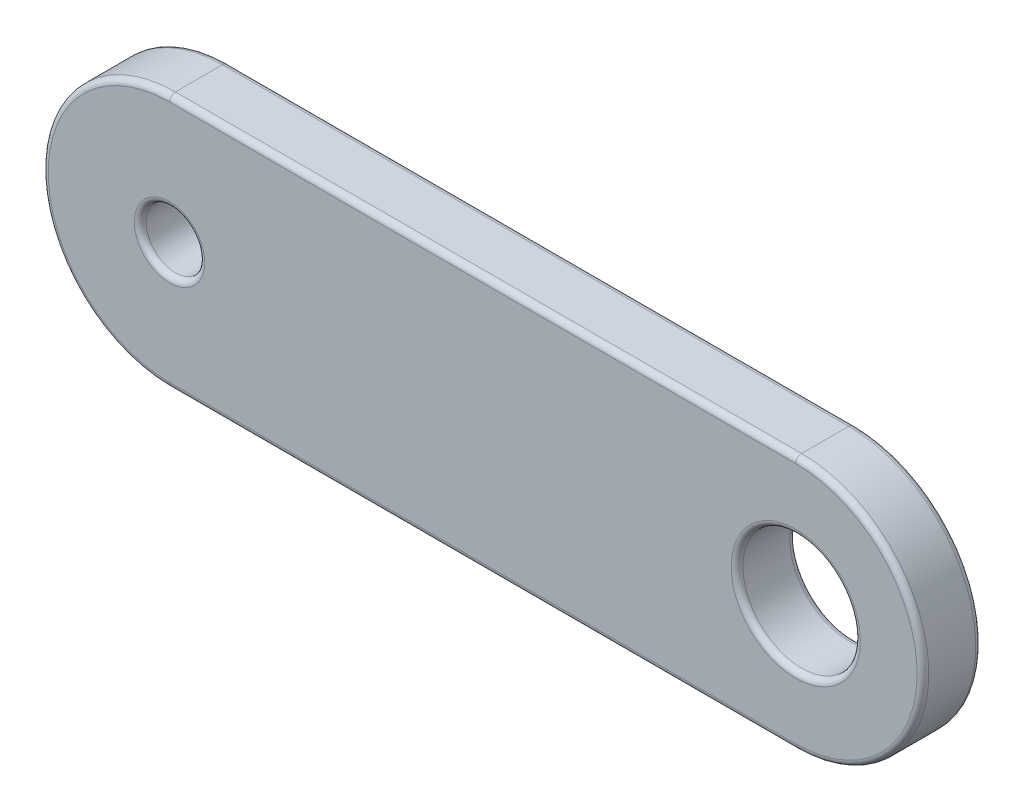
ISO-10303-21;
HEADER;
FILE_DESCRIPTION(('STEP AP214'),'2;1');
FILE_NAME('part.step','',(''),(''),'','','');
FILE_SCHEMA(('AUTOMOTIVE_DESIGN { 1 0 10303 214 1 1 1 1 }'));
ENDSEC;
DATA;
#1=APPLICATION_CONTEXT('core data for automotive mechanical design processes');
#2=APPLICATION_PROTOCOL_DEFINITION('international standard','automotive_design',2000,#1);
#3=PRODUCT_CONTEXT('',#1,'mechanical');
#4=PRODUCT('Part','Part','',(#3));
#5=PRODUCT_RELATED_PRODUCT_CATEGORY('part','',(#4));
#6=PRODUCT_DEFINITION_FORMATION('','',#4);
#7=PRODUCT_DEFINITION_CONTEXT('part definition',#1,'design');
#8=PRODUCT_DEFINITION('design','',#6,#7);
#9=PRODUCT_DEFINITION_SHAPE('','',#8);
#10=(LENGTH_UNIT() NAMED_UNIT(*) SI_UNIT(.MILLI.,.METRE.));
#11=(NAMED_UNIT(*) PLANE_ANGLE_UNIT() SI_UNIT($,.RADIAN.));
#12=(NAMED_UNIT(*) SI_UNIT($,.STERADIAN.) SOLID_ANGLE_UNIT());
#13=UNCERTAINTY_MEASURE_WITH_UNIT(LENGTH_MEASURE(1.E-05),#10,'distance_accuracy_value','');
#14=(GEOMETRIC_REPRESENTATION_CONTEXT(3) GLOBAL_UNCERTAINTY_ASSIGNED_CONTEXT((#13)) GLOBAL_UNIT_ASSIGNED_CONTEXT((#10,
#11,#12)) REPRESENTATION_CONTEXT('',''));
#15=CARTESIAN_POINT('',(0.,0.,0.));
#16=DIRECTION('',(0.,0.,1.));
#17=DIRECTION('',(1.,0.,0.));
#18=AXIS2_PLACEMENT_3D('',#15,#16,#17);
#19=CARTESIAN_POINT('',(-8.,0.,0.75));
#20=DIRECTION('',(0.,0.,1.));
#21=DIRECTION('',(1.,0.,0.));
#22=AXIS2_PLACEMENT_3D('',#19,#20,#21);
#23=PLANE('',#22);
#24=CARTESIAN_POINT('',(8.,0.,0.75));
#25=DIRECTION('',(0.,0.,1.));
#26=DIRECTION('',(1.,0.,0.));
#27=AXIS2_PLACEMENT_3D('',#24,#25,#26);
#28=CIRCLE('',#27,1.65);
#29=CARTESIAN_POINT('',(9.65,0.,0.75));
#30=VERTEX_POINT('',#29);
#31=EDGE_CURVE('E11',#30,#30,#28,.F.);
#32=ORIENTED_EDGE('',*,*,#31,.T.);
#33=EDGE_LOOP('',(#32));
#34=FACE_BOUND('',#33,.T.);
#35=CARTESIAN_POINT('',(8.,0.,0.75));
#36=DIRECTION('',(0.,0.,1.));
#37=DIRECTION('',(1.,0.,0.));
#38=AXIS2_PLACEMENT_3D('',#35,#36,#37);
#39=CIRCLE('',#38,3.1);
#40=CARTESIAN_POINT('',(8.,-3.1,0.75));
#41=VERTEX_POINT('',#40);
#42=CARTESIAN_POINT('',(8.,3.1,0.75));
#43=VERTEX_POINT('',#42);
#44=EDGE_CURVE('E56',#41,#43,#39,.T.);
#45=ORIENTED_EDGE('',*,*,#44,.T.);
#46=DIRECTION('',(-1.,0.,0.));
#47=VECTOR('',#46,1.);
#48=CARTESIAN_POINT('',(-8.,3.1,0.75));
#49=LINE('',#48,#47);
#50=CARTESIAN_POINT('',(-8.,3.1,0.75));
#51=VERTEX_POINT('',#50);
#52=EDGE_CURVE('E48',#43,#51,#49,.T.);
#53=ORIENTED_EDGE('',*,*,#52,.T.);
#54=CARTESIAN_POINT('',(-8.,0.,0.75));
#55=DIRECTION('',(0.,0.,1.));
#56=DIRECTION('',(1.,0.,0.));
#57=AXIS2_PLACEMENT_3D('',#54,#55,#56);
#58=CIRCLE('',#57,3.1);
#59=CARTESIAN_POINT('',(-8.,-3.1,0.75));
#60=VERTEX_POINT('',#59);
#61=EDGE_CURVE('E174',#51,#60,#58,.T.);
#62=ORIENTED_EDGE('',*,*,#61,.T.);
#63=DIRECTION('',(1.,0.,0.));
#64=VECTOR('',#63,1.);
#65=CARTESIAN_POINT('',(8.,-3.1,0.75));
#66=LINE('',#65,#64);
#67=EDGE_CURVE('E61',#60,#41,#66,.T.);
#68=ORIENTED_EDGE('',*,*,#67,.T.);
#69=EDGE_LOOP('',(#45,#53,#62,#68));
#70=FACE_BOUND('',#69,.T.);
#71=CARTESIAN_POINT('',(-8.,0.,0.75));
#72=DIRECTION('',(0.,0.,1.));
#73=DIRECTION('',(1.,0.,0.));
#74=AXIS2_PLACEMENT_3D('',#71,#72,#73);
#75=CIRCLE('',#74,0.9);
#76=CARTESIAN_POINT('',(-7.1,0.,0.75));
#77=VERTEX_POINT('',#76);
#78=EDGE_CURVE('E171',#77,#77,#75,.F.);
#79=ORIENTED_EDGE('',*,*,#78,.T.);
#80=EDGE_LOOP('',(#79));
#81=FACE_BOUND('',#80,.T.);
#82=ADVANCED_FACE('F39',(#34,#70,#81),#23,.T.);
#83=CARTESIAN_POINT('',(-8.,0.,-0.75));
#84=DIRECTION('',(0.,0.,1.));
#85=DIRECTION('',(1.,0.,0.));
#86=AXIS2_PLACEMENT_3D('',#83,#84,#85);
#87=PLANE('',#86);
#88=CARTESIAN_POINT('',(8.,0.,-0.75));
#89=DIRECTION('',(0.,0.,1.));
#90=DIRECTION('',(1.,0.,0.));
#91=AXIS2_PLACEMENT_3D('',#88,#89,#90);
#92=CIRCLE('',#91,1.65);
#93=CARTESIAN_POINT('',(9.65,0.,-0.75));
#94=VERTEX_POINT('',#93);
#95=EDGE_CURVE('E136',#94,#94,#92,.T.);
#96=ORIENTED_EDGE('',*,*,#95,.T.);
#97=EDGE_LOOP('',(#96));
#98=FACE_BOUND('',#97,.T.);
#99=CARTESIAN_POINT('',(-8.,0.,-0.75));
#100=DIRECTION('',(0.,0.,1.));
#101=DIRECTION('',(1.,0.,0.));
#102=AXIS2_PLACEMENT_3D('',#99,#100,#101);
#103=CIRCLE('',#102,0.9);
#104=CARTESIAN_POINT('',(-7.1,0.,-0.75));
#105=VERTEX_POINT('',#104);
#106=EDGE_CURVE('E133',#105,#105,#103,.T.);
#107=ORIENTED_EDGE('',*,*,#106,.T.);
#108=EDGE_LOOP('',(#107));
#109=FACE_BOUND('',#108,.T.);
#110=CARTESIAN_POINT('',(8.,0.,-0.75));
#111=DIRECTION('',(0.,0.,1.));
#112=DIRECTION('',(1.,0.,0.));
#113=AXIS2_PLACEMENT_3D('',#110,#111,#112);
#114=CIRCLE('',#113,3.1);
#115=CARTESIAN_POINT('',(8.,3.1,-0.75));
#116=VERTEX_POINT('',#115);
#117=CARTESIAN_POINT('',(8.,-3.1,-0.75));
#118=VERTEX_POINT('',#117);
#119=EDGE_CURVE('E132',#116,#118,#114,.F.);
#120=ORIENTED_EDGE('',*,*,#119,.T.);
#121=DIRECTION('',(1.,0.,0.));
#122=VECTOR('',#121,1.);
#123=CARTESIAN_POINT('',(-8.,-3.1,-0.75));
#124=LINE('',#123,#122);
#125=CARTESIAN_POINT('',(-8.,-3.1,-0.75));
#126=VERTEX_POINT('',#125);
#127=EDGE_CURVE('E111',#118,#126,#124,.F.);
#128=ORIENTED_EDGE('',*,*,#127,.T.);
#129=CARTESIAN_POINT('',(-8.,0.,-0.75));
#130=DIRECTION('',(0.,0.,1.));
#131=DIRECTION('',(1.,0.,0.));
#132=AXIS2_PLACEMENT_3D('',#129,#130,#131);
#133=CIRCLE('',#132,3.1);
#134=CARTESIAN_POINT('',(-8.,3.1,-0.75));
#135=VERTEX_POINT('',#134);
#136=EDGE_CURVE('E121',#126,#135,#133,.F.);
#137=ORIENTED_EDGE('',*,*,#136,.T.);
#138=DIRECTION('',(-1.,0.,0.));
#139=VECTOR('',#138,1.);
#140=CARTESIAN_POINT('',(-8.,3.1,-0.75));
#141=LINE('',#140,#139);
#142=EDGE_CURVE('E127',#135,#116,#141,.F.);
#143=ORIENTED_EDGE('',*,*,#142,.T.);
#144=EDGE_LOOP('',(#120,#128,#137,#143));
#145=FACE_BOUND('',#144,.T.);
#146=ADVANCED_FACE('F130',(#98,#109,#145),#87,.F.);
#147=CARTESIAN_POINT('',(-8.,0.,0.75));
#148=DIRECTION('',(0.,0.,-1.));
#149=DIRECTION('',(-1.,0.,0.));
#150=AXIS2_PLACEMENT_3D('',#147,#148,#149);
#151=CYLINDRICAL_SURFACE('',#150,3.25);
#152=DIRECTION('',(0.,0.,-1.));
#153=VECTOR('',#152,1.);
#154=CARTESIAN_POINT('',(-8.,3.25,0.75));
#155=LINE('',#154,#153);
#156=CARTESIAN_POINT('',(-8.,3.25,0.6));
#157=VERTEX_POINT('',#156);
#158=CARTESIAN_POINT('',(-8.,3.25,-0.6));
#159=VERTEX_POINT('',#158);
#160=EDGE_CURVE('E183',#157,#159,#155,.T.);
#161=ORIENTED_EDGE('',*,*,#160,.T.);
#162=CARTESIAN_POINT('',(-8.,0.,-0.6));
#163=DIRECTION('',(0.,0.,1.));
#164=DIRECTION('',(1.,0.,0.));
#165=AXIS2_PLACEMENT_3D('',#162,#163,#164);
#166=CIRCLE('',#165,3.25);
#167=CARTESIAN_POINT('',(-8.,-3.25,-0.6));
#168=VERTEX_POINT('',#167);
#169=EDGE_CURVE('E169',#159,#168,#166,.T.);
#170=ORIENTED_EDGE('',*,*,#169,.T.);
#171=DIRECTION('',(0.,0.,-1.));
#172=VECTOR('',#171,1.);
#173=CARTESIAN_POINT('',(-8.,-3.25,0.75));
#174=LINE('',#173,#172);
#175=CARTESIAN_POINT('',(-8.,-3.25,0.6));
#176=VERTEX_POINT('',#175);
#177=EDGE_CURVE('E128',#176,#168,#174,.T.);
#178=ORIENTED_EDGE('',*,*,#177,.F.);
#179=CARTESIAN_POINT('',(-8.,0.,0.6));
#180=DIRECTION('',(0.,0.,1.));
#181=DIRECTION('',(1.,0.,0.));
#182=AXIS2_PLACEMENT_3D('',#179,#180,#181);
#183=CIRCLE('',#182,3.25);
#184=EDGE_CURVE('E167',#176,#157,#183,.F.);
#185=ORIENTED_EDGE('',*,*,#184,.T.);
#186=EDGE_LOOP('',(#161,#170,#178,#185));
#187=FACE_BOUND('',#186,.T.);
#188=ADVANCED_FACE('F209',(#187),#151,.T.);
#189=CARTESIAN_POINT('',(-8.,-3.25,0.75));
#190=DIRECTION('',(0.,1.,0.));
#191=DIRECTION('',(-1.,0.,0.));
#192=AXIS2_PLACEMENT_3D('',#189,#190,#191);
#193=PLANE('',#192);
#194=ORIENTED_EDGE('',*,*,#177,.T.);
#195=DIRECTION('',(1.,0.,0.));
#196=VECTOR('',#195,1.);
#197=CARTESIAN_POINT('',(-8.,-3.25,-0.6));
#198=LINE('',#197,#196);
#199=CARTESIAN_POINT('',(8.,-3.25,-0.6));
#200=VERTEX_POINT('',#199);
#201=EDGE_CURVE('E114',#168,#200,#198,.T.);
#202=ORIENTED_EDGE('',*,*,#201,.T.);
#203=DIRECTION('',(0.,0.,-1.));
#204=VECTOR('',#203,1.);
#205=CARTESIAN_POINT('',(8.,-3.25,0.75));
#206=LINE('',#205,#204);
#207=CARTESIAN_POINT('',(8.,-3.25,0.6));
#208=VERTEX_POINT('',#207);
#209=EDGE_CURVE('E206',#208,#200,#206,.T.);
#210=ORIENTED_EDGE('',*,*,#209,.F.);
#211=DIRECTION('',(1.,0.,0.));
#212=VECTOR('',#211,1.);
#213=CARTESIAN_POINT('',(-8.,-3.25,0.6));
#214=LINE('',#213,#212);
#215=EDGE_CURVE('E155',#208,#176,#214,.F.);
#216=ORIENTED_EDGE('',*,*,#215,.T.);
#217=EDGE_LOOP('',(#194,#202,#210,#216));
#218=FACE_BOUND('',#217,.T.);
#219=ADVANCED_FACE('F204',(#218),#193,.F.);
#220=CARTESIAN_POINT('',(8.,0.,0.75));
#221=DIRECTION('',(0.,0.,-1.));
#222=DIRECTION('',(-1.,0.,0.));
#223=AXIS2_PLACEMENT_3D('',#220,#221,#222);
#224=CYLINDRICAL_SURFACE('',#223,3.25);
#225=ORIENTED_EDGE('',*,*,#209,.T.);
#226=CARTESIAN_POINT('',(8.,0.,-0.6));
#227=DIRECTION('',(0.,0.,1.));
#228=DIRECTION('',(1.,0.,0.));
#229=AXIS2_PLACEMENT_3D('',#226,#227,#228);
#230=CIRCLE('',#229,3.25);
#231=CARTESIAN_POINT('',(8.,3.25,-0.6));
#232=VERTEX_POINT('',#231);
#233=EDGE_CURVE('E160',#200,#232,#230,.T.);
#234=ORIENTED_EDGE('',*,*,#233,.T.);
#235=DIRECTION('',(0.,0.,-1.));
#236=VECTOR('',#235,1.);
#237=CARTESIAN_POINT('',(8.,3.25,0.75));
#238=LINE('',#237,#236);
#239=CARTESIAN_POINT('',(8.,3.25,0.6));
#240=VERTEX_POINT('',#239);
#241=EDGE_CURVE('E212',#240,#232,#238,.T.);
#242=ORIENTED_EDGE('',*,*,#241,.F.);
#243=CARTESIAN_POINT('',(8.,0.,0.6));
#244=DIRECTION('',(0.,0.,1.));
#245=DIRECTION('',(1.,0.,0.));
#246=AXIS2_PLACEMENT_3D('',#243,#244,#245);
#247=CIRCLE('',#246,3.25);
#248=EDGE_CURVE('E158',#240,#208,#247,.F.);
#249=ORIENTED_EDGE('',*,*,#248,.T.);
#250=EDGE_LOOP('',(#225,#234,#242,#249));
#251=FACE_BOUND('',#250,.T.);
#252=ADVANCED_FACE('F225',(#251),#224,.T.);
#253=CARTESIAN_POINT('',(-8.,3.25,0.75));
#254=DIRECTION('',(0.,-1.,0.));
#255=DIRECTION('',(1.,0.,0.));
#256=AXIS2_PLACEMENT_3D('',#253,#254,#255);
#257=PLANE('',#256);
#258=ORIENTED_EDGE('',*,*,#241,.T.);
#259=DIRECTION('',(-1.,0.,0.));
#260=VECTOR('',#259,1.);
#261=CARTESIAN_POINT('',(-8.,3.25,-0.6));
#262=LINE('',#261,#260);
#263=EDGE_CURVE('E165',#232,#159,#262,.T.);
#264=ORIENTED_EDGE('',*,*,#263,.T.);
#265=ORIENTED_EDGE('',*,*,#160,.F.);
#266=DIRECTION('',(-1.,0.,0.));
#267=VECTOR('',#266,1.);
#268=CARTESIAN_POINT('',(8.,3.25,0.6));
#269=LINE('',#268,#267);
#270=EDGE_CURVE('E162',#157,#240,#269,.F.);
#271=ORIENTED_EDGE('',*,*,#270,.T.);
#272=EDGE_LOOP('',(#258,#264,#265,#271));
#273=FACE_BOUND('',#272,.T.);
#274=ADVANCED_FACE('F229',(#273),#257,.F.);
#275=CARTESIAN_POINT('',(-8.,0.,0.75));
#276=DIRECTION('',(0.,0.,-1.));
#277=DIRECTION('',(-1.,0.,0.));
#278=AXIS2_PLACEMENT_3D('',#275,#276,#277);
#279=CYLINDRICAL_SURFACE('',#278,0.75);
#280=CARTESIAN_POINT('',(-8.,0.,-0.6));
#281=DIRECTION('',(0.,0.,1.));
#282=DIRECTION('',(1.,0.,0.));
#283=AXIS2_PLACEMENT_3D('',#280,#281,#282);
#284=CIRCLE('',#283,0.75);
#285=CARTESIAN_POINT('',(-7.25,0.,-0.6));
#286=VERTEX_POINT('',#285);
#287=EDGE_CURVE('E152',#286,#286,#284,.F.);
#288=ORIENTED_EDGE('',*,*,#287,.T.);
#289=EDGE_LOOP('',(#288));
#290=FACE_BOUND('',#289,.T.);
#291=CARTESIAN_POINT('',(-8.,0.,0.6));
#292=DIRECTION('',(0.,0.,1.));
#293=DIRECTION('',(1.,0.,0.));
#294=AXIS2_PLACEMENT_3D('',#291,#292,#293);
#295=CIRCLE('',#294,0.75);
#296=CARTESIAN_POINT('',(-7.25,0.,0.6));
#297=VERTEX_POINT('',#296);
#298=EDGE_CURVE('E149',#297,#297,#295,.T.);
#299=ORIENTED_EDGE('',*,*,#298,.T.);
#300=EDGE_LOOP('',(#299));
#301=FACE_BOUND('',#300,.T.);
#302=ADVANCED_FACE('F245',(#290,#301),#279,.F.);
#303=CARTESIAN_POINT('',(8.,0.,0.75));
#304=DIRECTION('',(0.,0.,-1.));
#305=DIRECTION('',(-1.,0.,0.));
#306=AXIS2_PLACEMENT_3D('',#303,#304,#305);
#307=CYLINDRICAL_SURFACE('',#306,1.5);
#308=CARTESIAN_POINT('',(8.,0.,-0.6));
#309=DIRECTION('',(0.,0.,1.));
#310=DIRECTION('',(1.,0.,0.));
#311=AXIS2_PLACEMENT_3D('',#308,#309,#310);
#312=CIRCLE('',#311,1.5);
#313=CARTESIAN_POINT('',(9.5,0.,-0.6));
#314=VERTEX_POINT('',#313);
#315=EDGE_CURVE('E146',#314,#314,#312,.F.);
#316=ORIENTED_EDGE('',*,*,#315,.T.);
#317=EDGE_LOOP('',(#316));
#318=FACE_BOUND('',#317,.T.);
#319=CARTESIAN_POINT('',(8.,0.,0.6));
#320=DIRECTION('',(0.,0.,1.));
#321=DIRECTION('',(1.,0.,0.));
#322=AXIS2_PLACEMENT_3D('',#319,#320,#321);
#323=CIRCLE('',#322,1.5);
#324=CARTESIAN_POINT('',(9.5,0.,0.6));
#325=VERTEX_POINT('',#324);
#326=EDGE_CURVE('E143',#325,#325,#323,.T.);
#327=ORIENTED_EDGE('',*,*,#326,.T.);
#328=EDGE_LOOP('',(#327));
#329=FACE_BOUND('',#328,.T.);
#330=ADVANCED_FACE('F247',(#318,#329),#307,.F.);
#331=CARTESIAN_POINT('',(8.,0.,-0.6));
#332=DIRECTION('',(0.,0.,1.));
#333=DIRECTION('',(1.,0.,0.));
#334=AXIS2_PLACEMENT_3D('',#331,#332,#333);
#335=TOROIDAL_SURFACE('',#334,1.65,0.15);
#336=ORIENTED_EDGE('',*,*,#315,.F.);
#337=EDGE_LOOP('',(#336));
#338=FACE_BOUND('',#337,.T.);
#339=ORIENTED_EDGE('',*,*,#95,.F.);
#340=EDGE_LOOP('',(#339));
#341=FACE_BOUND('',#340,.T.);
#342=ADVANCED_FACE('F254',(#338,#341),#335,.T.);
#343=CARTESIAN_POINT('',(-8.,0.,-0.6));
#344=DIRECTION('',(0.,0.,1.));
#345=DIRECTION('',(1.,0.,0.));
#346=AXIS2_PLACEMENT_3D('',#343,#344,#345);
#347=TOROIDAL_SURFACE('',#346,0.9,0.15);
#348=ORIENTED_EDGE('',*,*,#287,.F.);
#349=EDGE_LOOP('',(#348));
#350=FACE_BOUND('',#349,.T.);
#351=ORIENTED_EDGE('',*,*,#106,.F.);
#352=EDGE_LOOP('',(#351));
#353=FACE_BOUND('',#352,.T.);
#354=ADVANCED_FACE('F270',(#350,#353),#347,.T.);
#355=CARTESIAN_POINT('',(-8.,3.1,-0.6));
#356=DIRECTION('',(-1.,0.,0.));
#357=DIRECTION('',(0.,-1.,0.));
#358=AXIS2_PLACEMENT_3D('',#355,#356,#357);
#359=CYLINDRICAL_SURFACE('',#358,0.15);
#360=CARTESIAN_POINT('',(8.,3.1,-0.6));
#361=DIRECTION('',(1.,0.,0.));
#362=DIRECTION('',(0.,0.,-1.));
#363=AXIS2_PLACEMENT_3D('',#360,#361,#362);
#364=CIRCLE('',#363,0.15);
#365=EDGE_CURVE('E117',#116,#232,#364,.T.);
#366=ORIENTED_EDGE('',*,*,#365,.F.);
#367=ORIENTED_EDGE('',*,*,#142,.F.);
#368=CARTESIAN_POINT('',(-8.,3.1,-0.6));
#369=DIRECTION('',(-1.,0.,0.));
#370=DIRECTION('',(0.,0.,1.));
#371=AXIS2_PLACEMENT_3D('',#368,#369,#370);
#372=CIRCLE('',#371,0.15);
#373=EDGE_CURVE('E124',#159,#135,#372,.T.);
#374=ORIENTED_EDGE('',*,*,#373,.F.);
#375=ORIENTED_EDGE('',*,*,#263,.F.);
#376=EDGE_LOOP('',(#366,#367,#374,#375));
#377=FACE_BOUND('',#376,.T.);
#378=ADVANCED_FACE('F218',(#377),#359,.T.);
#379=CARTESIAN_POINT('',(-8.,0.,-0.6));
#380=DIRECTION('',(0.,0.,1.));
#381=DIRECTION('',(1.,0.,0.));
#382=AXIS2_PLACEMENT_3D('',#379,#380,#381);
#383=TOROIDAL_SURFACE('',#382,3.1,0.15);
#384=ORIENTED_EDGE('',*,*,#373,.T.);
#385=ORIENTED_EDGE('',*,*,#136,.F.);
#386=CARTESIAN_POINT('',(-8.,-3.1,-0.6));
#387=DIRECTION('',(1.,0.,0.));
#388=DIRECTION('',(0.,0.,-1.));
#389=AXIS2_PLACEMENT_3D('',#386,#387,#388);
#390=CIRCLE('',#389,0.15);
#391=EDGE_CURVE('E107',#168,#126,#390,.T.);
#392=ORIENTED_EDGE('',*,*,#391,.F.);
#393=ORIENTED_EDGE('',*,*,#169,.F.);
#394=EDGE_LOOP('',(#384,#385,#392,#393));
#395=FACE_BOUND('',#394,.T.);
#396=ADVANCED_FACE('F122',(#395),#383,.T.);
#397=CARTESIAN_POINT('',(8.,0.,-0.6));
#398=DIRECTION('',(0.,0.,1.));
#399=DIRECTION('',(1.,0.,0.));
#400=AXIS2_PLACEMENT_3D('',#397,#398,#399);
#401=TOROIDAL_SURFACE('',#400,3.1,0.15);
#402=ORIENTED_EDGE('',*,*,#365,.T.);
#403=ORIENTED_EDGE('',*,*,#233,.F.);
#404=CARTESIAN_POINT('',(8.,-3.1,-0.6));
#405=DIRECTION('',(-1.,0.,0.));
#406=DIRECTION('',(0.,0.,1.));
#407=AXIS2_PLACEMENT_3D('',#404,#405,#406);
#408=CIRCLE('',#407,0.15);
#409=EDGE_CURVE('E118',#118,#200,#408,.T.);
#410=ORIENTED_EDGE('',*,*,#409,.F.);
#411=ORIENTED_EDGE('',*,*,#119,.F.);
#412=EDGE_LOOP('',(#402,#403,#410,#411));
#413=FACE_BOUND('',#412,.T.);
#414=ADVANCED_FACE('F221',(#413),#401,.T.);
#415=CARTESIAN_POINT('',(-8.,-3.1,-0.6));
#416=DIRECTION('',(1.,0.,0.));
#417=DIRECTION('',(0.,1.,0.));
#418=AXIS2_PLACEMENT_3D('',#415,#416,#417);
#419=CYLINDRICAL_SURFACE('',#418,0.15);
#420=ORIENTED_EDGE('',*,*,#391,.T.);
#421=ORIENTED_EDGE('',*,*,#127,.F.);
#422=ORIENTED_EDGE('',*,*,#409,.T.);
#423=ORIENTED_EDGE('',*,*,#201,.F.);
#424=EDGE_LOOP('',(#420,#421,#422,#423));
#425=FACE_BOUND('',#424,.T.);
#426=ADVANCED_FACE('F109',(#425),#419,.T.);
#427=CARTESIAN_POINT('',(8.,0.,0.6));
#428=DIRECTION('',(0.,0.,1.));
#429=DIRECTION('',(1.,0.,0.));
#430=AXIS2_PLACEMENT_3D('',#427,#428,#429);
#431=TOROIDAL_SURFACE('',#430,1.65,0.15);
#432=ORIENTED_EDGE('',*,*,#31,.F.);
#433=EDGE_LOOP('',(#432));
#434=FACE_BOUND('',#433,.T.);
#435=ORIENTED_EDGE('',*,*,#326,.F.);
#436=EDGE_LOOP('',(#435));
#437=FACE_BOUND('',#436,.T.);
#438=ADVANCED_FACE('F277',(#434,#437),#431,.T.);
#439=CARTESIAN_POINT('',(-8.,-3.1,0.6));
#440=DIRECTION('',(-1.,0.,0.));
#441=DIRECTION('',(0.,-1.,0.));
#442=AXIS2_PLACEMENT_3D('',#439,#440,#441);
#443=CYLINDRICAL_SURFACE('',#442,0.15);
#444=CARTESIAN_POINT('',(-8.,-3.1,0.6));
#445=DIRECTION('',(-1.,0.,0.));
#446=DIRECTION('',(0.,0.,1.));
#447=AXIS2_PLACEMENT_3D('',#444,#445,#446);
#448=CIRCLE('',#447,0.15);
#449=EDGE_CURVE('E187',#176,#60,#448,.T.);
#450=ORIENTED_EDGE('',*,*,#449,.F.);
#451=ORIENTED_EDGE('',*,*,#215,.F.);
#452=CARTESIAN_POINT('',(8.,-3.1,0.6));
#453=DIRECTION('',(1.,0.,0.));
#454=DIRECTION('',(0.,0.,-1.));
#455=AXIS2_PLACEMENT_3D('',#452,#453,#454);
#456=CIRCLE('',#455,0.15);
#457=EDGE_CURVE('E43',#41,#208,#456,.T.);
#458=ORIENTED_EDGE('',*,*,#457,.F.);
#459=ORIENTED_EDGE('',*,*,#67,.F.);
#460=EDGE_LOOP('',(#450,#451,#458,#459));
#461=FACE_BOUND('',#460,.T.);
#462=ADVANCED_FACE('F199',(#461),#443,.T.);
#463=CARTESIAN_POINT('',(8.,0.,0.6));
#464=DIRECTION('',(0.,0.,1.));
#465=DIRECTION('',(1.,0.,0.));
#466=AXIS2_PLACEMENT_3D('',#463,#464,#465);
#467=TOROIDAL_SURFACE('',#466,3.1,0.15);
#468=ORIENTED_EDGE('',*,*,#457,.T.);
#469=ORIENTED_EDGE('',*,*,#248,.F.);
#470=CARTESIAN_POINT('',(8.,3.1,0.6));
#471=DIRECTION('',(-1.,0.,0.));
#472=DIRECTION('',(0.,0.,1.));
#473=AXIS2_PLACEMENT_3D('',#470,#471,#472);
#474=CIRCLE('',#473,0.15);
#475=EDGE_CURVE('E186',#43,#240,#474,.T.);
#476=ORIENTED_EDGE('',*,*,#475,.F.);
#477=ORIENTED_EDGE('',*,*,#44,.F.);
#478=EDGE_LOOP('',(#468,#469,#476,#477));
#479=FACE_BOUND('',#478,.T.);
#480=ADVANCED_FACE('F196',(#479),#467,.T.);
#481=CARTESIAN_POINT('',(-8.,0.,0.6));
#482=DIRECTION('',(0.,0.,1.));
#483=DIRECTION('',(1.,0.,0.));
#484=AXIS2_PLACEMENT_3D('',#481,#482,#483);
#485=TOROIDAL_SURFACE('',#484,3.1,0.15);
#486=ORIENTED_EDGE('',*,*,#449,.T.);
#487=ORIENTED_EDGE('',*,*,#61,.F.);
#488=CARTESIAN_POINT('',(-8.,3.1,0.6));
#489=DIRECTION('',(1.,0.,0.));
#490=DIRECTION('',(0.,0.,-1.));
#491=AXIS2_PLACEMENT_3D('',#488,#489,#490);
#492=CIRCLE('',#491,0.15);
#493=EDGE_CURVE('E184',#157,#51,#492,.T.);
#494=ORIENTED_EDGE('',*,*,#493,.F.);
#495=ORIENTED_EDGE('',*,*,#184,.F.);
#496=EDGE_LOOP('',(#486,#487,#494,#495));
#497=FACE_BOUND('',#496,.T.);
#498=ADVANCED_FACE('F234',(#497),#485,.T.);
#499=CARTESIAN_POINT('',(-8.,3.1,0.6));
#500=DIRECTION('',(1.,0.,0.));
#501=DIRECTION('',(0.,1.,0.));
#502=AXIS2_PLACEMENT_3D('',#499,#500,#501);
#503=CYLINDRICAL_SURFACE('',#502,0.15);
#504=ORIENTED_EDGE('',*,*,#475,.T.);
#505=ORIENTED_EDGE('',*,*,#270,.F.);
#506=ORIENTED_EDGE('',*,*,#493,.T.);
#507=ORIENTED_EDGE('',*,*,#52,.F.);
#508=EDGE_LOOP('',(#504,#505,#506,#507));
#509=FACE_BOUND('',#508,.T.);
#510=ADVANCED_FACE('F232',(#509),#503,.T.);
#511=CARTESIAN_POINT('',(-8.,0.,0.6));
#512=DIRECTION('',(0.,0.,1.));
#513=DIRECTION('',(1.,0.,0.));
#514=AXIS2_PLACEMENT_3D('',#511,#512,#513);
#515=TOROIDAL_SURFACE('',#514,0.9,0.15);
#516=ORIENTED_EDGE('',*,*,#78,.F.);
#517=EDGE_LOOP('',(#516));
#518=FACE_BOUND('',#517,.T.);
#519=ORIENTED_EDGE('',*,*,#298,.F.);
#520=EDGE_LOOP('',(#519));
#521=FACE_BOUND('',#520,.T.);
#522=ADVANCED_FACE('F41',(#518,#521),#515,.T.);
#523=CLOSED_SHELL('',(#82,#146,#188,#219,#252,#274,#302,#330,#342,#354,#378,#396,#414,#426,#438,
#462,#480,#498,#510,#522));
#524=MANIFOLD_SOLID_BREP('B2',#523);
#525=ADVANCED_BREP_SHAPE_REPRESENTATION('',(#18,#524),#14);
#526=SHAPE_DEFINITION_REPRESENTATION(#9,#525);
ENDSEC;
END-ISO-10303-21;
